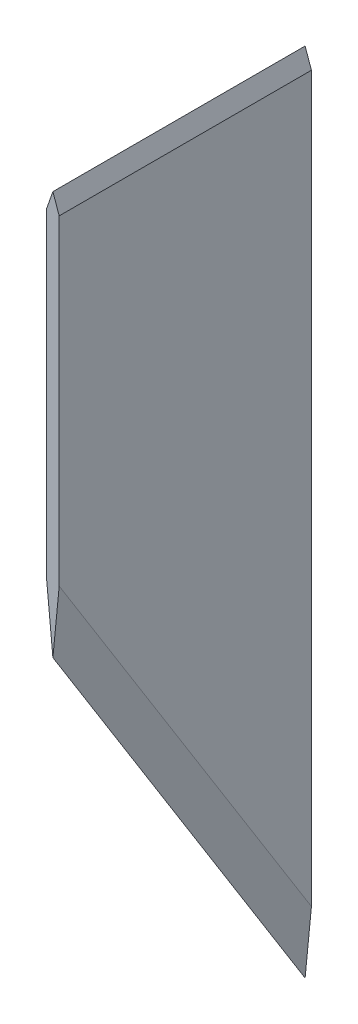
ISO-10303-21;
HEADER;
FILE_DESCRIPTION(('STEP AP214'),'2;1');
FILE_NAME('part.step','',(''),(''),'','','');
FILE_SCHEMA(('AUTOMOTIVE_DESIGN { 1 0 10303 214 1 1 1 1 }'));
ENDSEC;
DATA;
#1=APPLICATION_CONTEXT('core data for automotive mechanical design processes');
#2=APPLICATION_PROTOCOL_DEFINITION('international standard','automotive_design',2000,#1);
#3=PRODUCT_CONTEXT('',#1,'mechanical');
#4=PRODUCT('Part','Part','',(#3));
#5=PRODUCT_RELATED_PRODUCT_CATEGORY('part','',(#4));
#6=PRODUCT_DEFINITION_FORMATION('','',#4);
#7=PRODUCT_DEFINITION_CONTEXT('part definition',#1,'design');
#8=PRODUCT_DEFINITION('design','',#6,#7);
#9=PRODUCT_DEFINITION_SHAPE('','',#8);
#10=(LENGTH_UNIT() NAMED_UNIT(*) SI_UNIT(.MILLI.,.METRE.));
#11=(NAMED_UNIT(*) PLANE_ANGLE_UNIT() SI_UNIT($,.RADIAN.));
#12=(NAMED_UNIT(*) SI_UNIT($,.STERADIAN.) SOLID_ANGLE_UNIT());
#13=UNCERTAINTY_MEASURE_WITH_UNIT(LENGTH_MEASURE(1.E-05),#10,'distance_accuracy_value','');
#14=(GEOMETRIC_REPRESENTATION_CONTEXT(3) GLOBAL_UNCERTAINTY_ASSIGNED_CONTEXT((#13)) GLOBAL_UNIT_ASSIGNED_CONTEXT((#10,
#11,#12)) REPRESENTATION_CONTEXT('',''));
#15=CARTESIAN_POINT('',(0.,0.,0.));
#16=DIRECTION('',(0.,0.,1.));
#17=DIRECTION('',(1.,0.,0.));
#18=AXIS2_PLACEMENT_3D('',#15,#16,#17);
#19=CARTESIAN_POINT('',(3.175,0.,0.));
#20=DIRECTION('',(0.,0.,1.));
#21=DIRECTION('',(1.,0.,0.));
#22=AXIS2_PLACEMENT_3D('',#19,#20,#21);
#23=PLANE('',#22);
#24=DIRECTION('',(0.333148690033104,0.942874302507618,0.));
#25=VECTOR('',#24,1.);
#26=CARTESIAN_POINT('',(0.,198.70707236735,0.));
#27=LINE('',#26,#25);
#28=CARTESIAN_POINT('',(0.,198.70707236735,0.));
#29=VERTEX_POINT('',#28);
#30=CARTESIAN_POINT('',(1.5875,203.2,0.));
#31=VERTEX_POINT('',#30);
#32=EDGE_CURVE('E63',#29,#31,#27,.T.);
#33=ORIENTED_EDGE('',*,*,#32,.T.);
#34=DIRECTION('',(0.333148690033104,-0.942874302507618,0.));
#35=VECTOR('',#34,1.);
#36=CARTESIAN_POINT('',(1.5875,203.2,0.));
#37=LINE('',#36,#35);
#38=CARTESIAN_POINT('',(3.175,198.70707236735,0.));
#39=VERTEX_POINT('',#38);
#40=EDGE_CURVE('E112',#31,#39,#37,.T.);
#41=ORIENTED_EDGE('',*,*,#40,.T.);
#42=DIRECTION('',(0.,1.,0.));
#43=VECTOR('',#42,1.);
#44=CARTESIAN_POINT('',(3.175,0.,0.));
#45=LINE('',#44,#43);
#46=CARTESIAN_POINT('',(3.175,16.3844610094563,0.));
#47=VERTEX_POINT('',#46);
#48=EDGE_CURVE('E162',#47,#39,#45,.T.);
#49=ORIENTED_EDGE('',*,*,#48,.F.);
#50=DIRECTION('',(-0.0964389675429463,-0.995338899842285,0.));
#51=VECTOR('',#50,1.);
#52=CARTESIAN_POINT('',(1.60226450320644,0.152383261171594,0.));
#53=LINE('',#52,#51);
#54=CARTESIAN_POINT('',(1.5875,0.,0.));
#55=VERTEX_POINT('',#54);
#56=EDGE_CURVE('E158',#47,#55,#53,.T.);
#57=ORIENTED_EDGE('',*,*,#56,.T.);
#58=DIRECTION('',(-0.0964389675429465,0.995338899842285,0.));
#59=VECTOR('',#58,1.);
#60=CARTESIAN_POINT('',(1.60226450320644,-0.152383261171594,0.));
#61=LINE('',#60,#59);
#62=CARTESIAN_POINT('',(0.,16.3844610094563,0.));
#63=VERTEX_POINT('',#62);
#64=EDGE_CURVE('E151',#55,#63,#61,.T.);
#65=ORIENTED_EDGE('',*,*,#64,.T.);
#66=DIRECTION('',(0.,1.,0.));
#67=VECTOR('',#66,1.);
#68=CARTESIAN_POINT('',(0.,0.,0.));
#69=LINE('',#68,#67);
#70=EDGE_CURVE('E123',#63,#29,#69,.T.);
#71=ORIENTED_EDGE('',*,*,#70,.T.);
#72=EDGE_LOOP('',(#33,#41,#49,#57,#65,#71));
#73=FACE_BOUND('',#72,.T.);
#74=ADVANCED_FACE('F45',(#73),#23,.F.);
#75=CARTESIAN_POINT('',(3.175,203.2,63.5));
#76=DIRECTION('',(0.,0.,-1.));
#77=DIRECTION('',(0.,1.,0.));
#78=AXIS2_PLACEMENT_3D('',#75,#76,#77);
#79=PLANE('',#78);
#80=DIRECTION('',(0.,-1.,0.));
#81=VECTOR('',#80,1.);
#82=CARTESIAN_POINT('',(3.175,203.2,63.5));
#83=LINE('',#82,#81);
#84=CARTESIAN_POINT('',(3.175,198.70707236735,63.5));
#85=VERTEX_POINT('',#84);
#86=CARTESIAN_POINT('',(3.175,117.984461009456,63.5));
#87=VERTEX_POINT('',#86);
#88=EDGE_CURVE('E48',#85,#87,#83,.T.);
#89=ORIENTED_EDGE('',*,*,#88,.F.);
#90=DIRECTION('',(-0.333148690033104,0.942874302507618,0.));
#91=VECTOR('',#90,1.);
#92=CARTESIAN_POINT('',(1.76369352885235,202.70133872474,63.5));
#93=LINE('',#92,#91);
#94=CARTESIAN_POINT('',(1.5875,203.2,63.5));
#95=VERTEX_POINT('',#94);
#96=EDGE_CURVE('E137',#85,#95,#93,.T.);
#97=ORIENTED_EDGE('',*,*,#96,.T.);
#98=DIRECTION('',(-0.333148690033104,-0.942874302507618,0.));
#99=VECTOR('',#98,1.);
#100=CARTESIAN_POINT('',(1.76369352885235,203.69866127526,63.5));
#101=LINE('',#100,#99);
#102=CARTESIAN_POINT('',(0.,198.70707236735,63.5));
#103=VERTEX_POINT('',#102);
#104=EDGE_CURVE('E104',#95,#103,#101,.T.);
#105=ORIENTED_EDGE('',*,*,#104,.T.);
#106=DIRECTION('',(0.,-1.,0.));
#107=VECTOR('',#106,1.);
#108=CARTESIAN_POINT('',(0.,203.2,63.5));
#109=LINE('',#108,#107);
#110=CARTESIAN_POINT('',(0.,117.984461009456,63.5));
#111=VERTEX_POINT('',#110);
#112=EDGE_CURVE('E71',#103,#111,#109,.T.);
#113=ORIENTED_EDGE('',*,*,#112,.T.);
#114=DIRECTION('',(0.0964389675429465,-0.995338899842285,0.));
#115=VECTOR('',#114,1.);
#116=CARTESIAN_POINT('',(-8.15026421177558,202.102688533616,63.5));
#117=LINE('',#116,#115);
#118=CARTESIAN_POINT('',(1.58749999999999,101.6,63.5));
#119=VERTEX_POINT('',#118);
#120=EDGE_CURVE('E148',#111,#119,#117,.T.);
#121=ORIENTED_EDGE('',*,*,#120,.T.);
#122=DIRECTION('',(0.0964389675429463,0.995338899842285,0.));
#123=VECTOR('',#122,1.);
#124=CARTESIAN_POINT('',(11.3547932181884,202.407455055959,63.5));
#125=LINE('',#124,#123);
#126=EDGE_CURVE('E154',#119,#87,#125,.T.);
#127=ORIENTED_EDGE('',*,*,#126,.T.);
#128=EDGE_LOOP('',(#89,#97,#105,#113,#121,#127));
#129=FACE_BOUND('',#128,.T.);
#130=ADVANCED_FACE('F180',(#129),#79,.F.);
#131=CARTESIAN_POINT('',(3.175,0.,0.));
#132=DIRECTION('',(-1.,0.,0.));
#133=DIRECTION('',(0.,0.,1.));
#134=AXIS2_PLACEMENT_3D('',#131,#132,#133);
#135=PLANE('',#134);
#136=ORIENTED_EDGE('',*,*,#48,.T.);
#137=DIRECTION('',(0.,0.,1.));
#138=VECTOR('',#137,1.);
#139=CARTESIAN_POINT('',(3.175,198.70707236735,0.));
#140=LINE('',#139,#138);
#141=EDGE_CURVE('E108',#39,#85,#140,.T.);
#142=ORIENTED_EDGE('',*,*,#141,.T.);
#143=ORIENTED_EDGE('',*,*,#88,.T.);
#144=DIRECTION('',(0.,-0.847998304005088,-0.52999894000318));
#145=VECTOR('',#144,1.);
#146=CARTESIAN_POINT('',(3.175,4.60237668804953,-7.36380270087925));
#147=LINE('',#146,#145);
#148=EDGE_CURVE('E11',#87,#47,#147,.T.);
#149=ORIENTED_EDGE('',*,*,#148,.T.);
#150=EDGE_LOOP('',(#136,#142,#143,#149));
#151=FACE_BOUND('',#150,.T.);
#152=ADVANCED_FACE('F182',(#151),#135,.F.);
#153=CARTESIAN_POINT('',(0.,0.,0.));
#154=DIRECTION('',(-1.,0.,0.));
#155=DIRECTION('',(0.,0.,1.));
#156=AXIS2_PLACEMENT_3D('',#153,#154,#155);
#157=PLANE('',#156);
#158=DIRECTION('',(0.,0.,1.));
#159=VECTOR('',#158,1.);
#160=CARTESIAN_POINT('',(0.,198.70707236735,0.));
#161=LINE('',#160,#159);
#162=EDGE_CURVE('E109',#29,#103,#161,.T.);
#163=ORIENTED_EDGE('',*,*,#162,.F.);
#164=ORIENTED_EDGE('',*,*,#70,.F.);
#165=DIRECTION('',(0.,-0.847998304005088,-0.52999894000318));
#166=VECTOR('',#165,1.);
#167=CARTESIAN_POINT('',(0.,4.60237668804952,-7.36380270087923));
#168=LINE('',#167,#166);
#169=EDGE_CURVE('E55',#111,#63,#168,.T.);
#170=ORIENTED_EDGE('',*,*,#169,.F.);
#171=ORIENTED_EDGE('',*,*,#112,.F.);
#172=EDGE_LOOP('',(#163,#164,#170,#171));
#173=FACE_BOUND('',#172,.T.);
#174=ADVANCED_FACE('F178',(#173),#157,.T.);
#175=CARTESIAN_POINT('',(1.5875,0.,0.));
#176=DIRECTION('',(-0.983697257250656,0.0953110019904912,-0.152497603184786));
#177=DIRECTION('',(-0.1531950167546,0.,0.988195975928641));
#178=AXIS2_PLACEMENT_3D('',#175,#176,#177);
#179=PLANE('',#178);
#180=ORIENTED_EDGE('',*,*,#148,.F.);
#181=ORIENTED_EDGE('',*,*,#126,.F.);
#182=DIRECTION('',(0.,0.847998304005088,0.52999894000318));
#183=VECTOR('',#182,1.);
#184=CARTESIAN_POINT('',(1.5875,0.,0.));
#185=LINE('',#184,#183);
#186=EDGE_CURVE('E142',#55,#119,#185,.T.);
#187=ORIENTED_EDGE('',*,*,#186,.F.);
#188=ORIENTED_EDGE('',*,*,#56,.F.);
#189=EDGE_LOOP('',(#180,#181,#187,#188));
#190=FACE_BOUND('',#189,.T.);
#191=ADVANCED_FACE('F185',(#190),#179,.F.);
#192=CARTESIAN_POINT('',(0.,4.60237668804953,-7.36380270087925));
#193=DIRECTION('',(0.983697257250656,0.0953110019904914,-0.152497603184786));
#194=DIRECTION('',(-0.1531950167546,0.,-0.98819597592864));
#195=AXIS2_PLACEMENT_3D('',#192,#193,#194);
#196=PLANE('',#195);
#197=ORIENTED_EDGE('',*,*,#186,.T.);
#198=ORIENTED_EDGE('',*,*,#120,.F.);
#199=ORIENTED_EDGE('',*,*,#169,.T.);
#200=ORIENTED_EDGE('',*,*,#64,.F.);
#201=EDGE_LOOP('',(#197,#198,#199,#200));
#202=FACE_BOUND('',#201,.T.);
#203=ADVANCED_FACE('F175',(#202),#196,.F.);
#204=CARTESIAN_POINT('',(1.5875,203.2,0.));
#205=DIRECTION('',(-0.942874302507618,-0.333148690033104,0.));
#206=DIRECTION('',(0.333148690033104,-0.942874302507618,0.));
#207=AXIS2_PLACEMENT_3D('',#204,#205,#206);
#208=PLANE('',#207);
#209=ORIENTED_EDGE('',*,*,#141,.F.);
#210=ORIENTED_EDGE('',*,*,#40,.F.);
#211=DIRECTION('',(0.,0.,1.));
#212=VECTOR('',#211,1.);
#213=CARTESIAN_POINT('',(1.5875,203.2,0.));
#214=LINE('',#213,#212);
#215=EDGE_CURVE('E101',#31,#95,#214,.T.);
#216=ORIENTED_EDGE('',*,*,#215,.T.);
#217=ORIENTED_EDGE('',*,*,#96,.F.);
#218=EDGE_LOOP('',(#209,#210,#216,#217));
#219=FACE_BOUND('',#218,.T.);
#220=ADVANCED_FACE('F113',(#219),#208,.F.);
#221=CARTESIAN_POINT('',(0.,198.70707236735,0.));
#222=DIRECTION('',(0.942874302507618,-0.333148690033104,0.));
#223=DIRECTION('',(0.333148690033104,0.942874302507618,0.));
#224=AXIS2_PLACEMENT_3D('',#221,#222,#223);
#225=PLANE('',#224);
#226=ORIENTED_EDGE('',*,*,#215,.F.);
#227=ORIENTED_EDGE('',*,*,#32,.F.);
#228=ORIENTED_EDGE('',*,*,#162,.T.);
#229=ORIENTED_EDGE('',*,*,#104,.F.);
#230=EDGE_LOOP('',(#226,#227,#228,#229));
#231=FACE_BOUND('',#230,.T.);
#232=ADVANCED_FACE('F103',(#231),#225,.F.);
#233=CLOSED_SHELL('',(#74,#130,#152,#174,#191,#203,#220,#232));
#234=MANIFOLD_SOLID_BREP('B2',#233);
#235=ADVANCED_BREP_SHAPE_REPRESENTATION('',(#18,#234),#14);
#236=SHAPE_DEFINITION_REPRESENTATION(#9,#235);
ENDSEC;
END-ISO-10303-21;
